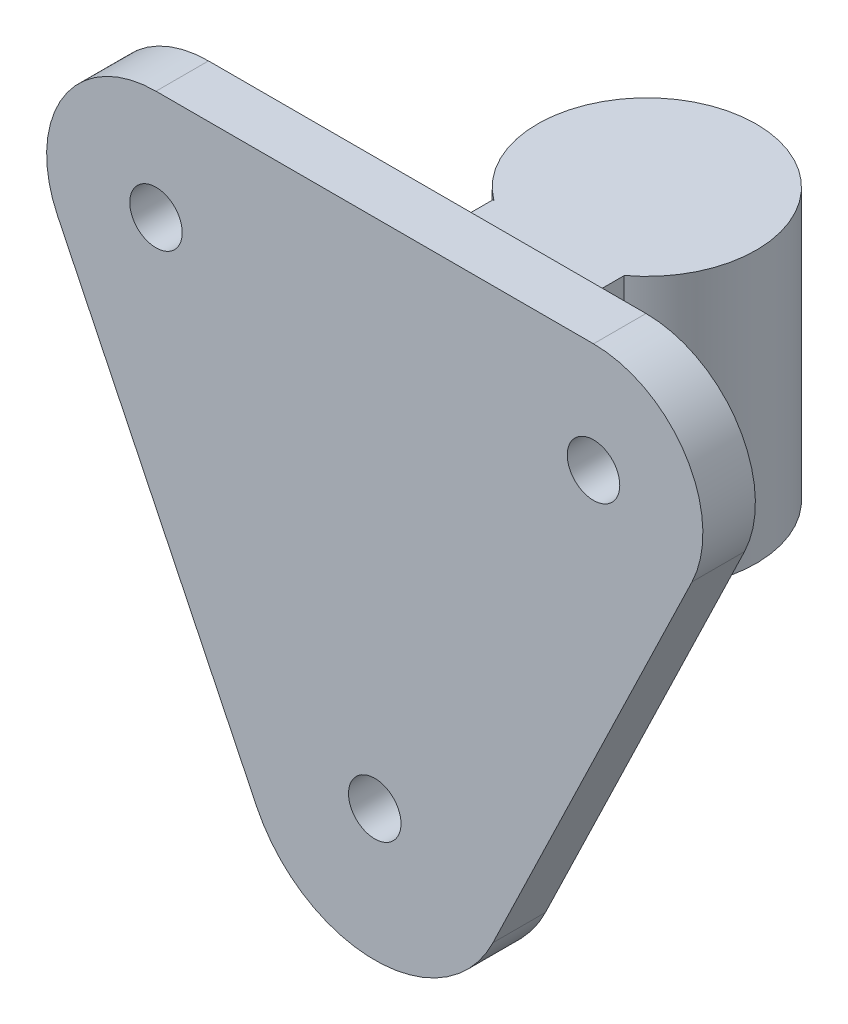
ISO-10303-21;
HEADER;
FILE_DESCRIPTION(('STEP AP214'),'2;1');
FILE_NAME('part.step','',(''),(''),'','','');
FILE_SCHEMA(('AUTOMOTIVE_DESIGN { 1 0 10303 214 1 1 1 1 }'));
ENDSEC;
DATA;
#1=APPLICATION_CONTEXT('core data for automotive mechanical design processes');
#2=APPLICATION_PROTOCOL_DEFINITION('international standard','automotive_design',2000,#1);
#3=PRODUCT_CONTEXT('',#1,'mechanical');
#4=PRODUCT('Part','Part','',(#3));
#5=PRODUCT_RELATED_PRODUCT_CATEGORY('part','',(#4));
#6=PRODUCT_DEFINITION_FORMATION('','',#4);
#7=PRODUCT_DEFINITION_CONTEXT('part definition',#1,'design');
#8=PRODUCT_DEFINITION('design','',#6,#7);
#9=PRODUCT_DEFINITION_SHAPE('','',#8);
#10=(LENGTH_UNIT() NAMED_UNIT(*) SI_UNIT(.MILLI.,.METRE.));
#11=(NAMED_UNIT(*) PLANE_ANGLE_UNIT() SI_UNIT($,.RADIAN.));
#12=(NAMED_UNIT(*) SI_UNIT($,.STERADIAN.) SOLID_ANGLE_UNIT());
#13=UNCERTAINTY_MEASURE_WITH_UNIT(LENGTH_MEASURE(1.E-05),#10,'distance_accuracy_value','');
#14=(GEOMETRIC_REPRESENTATION_CONTEXT(3) GLOBAL_UNCERTAINTY_ASSIGNED_CONTEXT((#13)) GLOBAL_UNIT_ASSIGNED_CONTEXT((#10,
#11,#12)) REPRESENTATION_CONTEXT('',''));
#15=CARTESIAN_POINT('',(0.,0.,0.));
#16=DIRECTION('',(0.,0.,1.));
#17=DIRECTION('',(1.,0.,0.));
#18=AXIS2_PLACEMENT_3D('',#15,#16,#17);
#19=CARTESIAN_POINT('',(-28.5820222076042,46.1801134077303,0.));
#20=DIRECTION('',(0.,0.,1.));
#21=DIRECTION('',(1.,0.,0.));
#22=AXIS2_PLACEMENT_3D('',#19,#20,#21);
#23=PLANE('',#22);
#24=CARTESIAN_POINT('',(-78.5820222076042,-45.8198865922697,0.));
#25=DIRECTION('',(0.,0.,1.));
#26=DIRECTION('',(1.,0.,0.));
#27=AXIS2_PLACEMENT_3D('',#24,#25,#26);
#28=CIRCLE('',#27,6.);
#29=CARTESIAN_POINT('',(-72.5820222076042,-45.8198865922697,0.));
#30=VERTEX_POINT('',#29);
#31=EDGE_CURVE('E206',#30,#30,#28,.T.);
#32=ORIENTED_EDGE('',*,*,#31,.T.);
#33=EDGE_LOOP('',(#32));
#34=FACE_BOUND('',#33,.T.);
#35=CARTESIAN_POINT('',(-28.5820222076042,46.1801134077303,0.));
#36=DIRECTION('',(0.,0.,1.));
#37=DIRECTION('',(1.,0.,0.));
#38=AXIS2_PLACEMENT_3D('',#35,#36,#37);
#39=CIRCLE('',#38,6.);
#40=CARTESIAN_POINT('',(-22.5820222076042,46.1801134077303,0.));
#41=VERTEX_POINT('',#40);
#42=EDGE_CURVE('E198',#41,#41,#39,.T.);
#43=ORIENTED_EDGE('',*,*,#42,.T.);
#44=EDGE_LOOP('',(#43));
#45=FACE_BOUND('',#44,.T.);
#46=CARTESIAN_POINT('',(-128.582022207604,46.1801134077303,0.));
#47=DIRECTION('',(0.,0.,1.));
#48=DIRECTION('',(1.,0.,0.));
#49=AXIS2_PLACEMENT_3D('',#46,#47,#48);
#50=CIRCLE('',#49,6.);
#51=CARTESIAN_POINT('',(-122.582022207604,46.1801134077303,0.));
#52=VERTEX_POINT('',#51);
#53=EDGE_CURVE('E189',#52,#52,#50,.T.);
#54=ORIENTED_EDGE('',*,*,#53,.T.);
#55=EDGE_LOOP('',(#54));
#56=FACE_BOUND('',#55,.T.);
#57=CARTESIAN_POINT('',(-28.5820222076042,46.1801134077303,0.));
#58=DIRECTION('',(0.,0.,1.));
#59=DIRECTION('',(1.,0.,0.));
#60=AXIS2_PLACEMENT_3D('',#57,#58,#59);
#61=CIRCLE('',#60,25.);
#62=CARTESIAN_POINT('',(-6.07141921436445,35.3047856940131,0.));
#63=VERTEX_POINT('',#62);
#64=CARTESIAN_POINT('',(-28.5820222076042,71.1801134077303,0.));
#65=VERTEX_POINT('',#64);
#66=EDGE_CURVE('E148',#63,#65,#61,.T.);
#67=ORIENTED_EDGE('',*,*,#66,.F.);
#68=DIRECTION('',(0.43501310854869,0.900424119729589,0.));
#69=VECTOR('',#68,1.);
#70=CARTESIAN_POINT('',(-6.07141921436445,35.3047856940131,0.));
#71=LINE('',#70,#69);
#72=CARTESIAN_POINT('',(-51.5692986157165,-58.8702798487304,0.));
#73=VERTEX_POINT('',#72);
#74=EDGE_CURVE('E97',#73,#63,#71,.T.);
#75=ORIENTED_EDGE('',*,*,#74,.F.);
#76=CARTESIAN_POINT('',(-78.5820222076042,-45.8198865922697,0.));
#77=DIRECTION('',(0.,0.,1.));
#78=DIRECTION('',(1.,0.,0.));
#79=AXIS2_PLACEMENT_3D('',#76,#77,#78);
#80=CIRCLE('',#79,30.);
#81=CARTESIAN_POINT('',(-105.594745799492,-58.8702798487304,0.));
#82=VERTEX_POINT('',#81);
#83=EDGE_CURVE('E161',#82,#73,#80,.T.);
#84=ORIENTED_EDGE('',*,*,#83,.F.);
#85=DIRECTION('',(0.43501310854869,-0.900424119729589,0.));
#86=VECTOR('',#85,1.);
#87=CARTESIAN_POINT('',(-151.092625200844,35.3047856940131,0.));
#88=LINE('',#87,#86);
#89=CARTESIAN_POINT('',(-151.092625200844,35.3047856940131,0.));
#90=VERTEX_POINT('',#89);
#91=EDGE_CURVE('E133',#90,#82,#88,.T.);
#92=ORIENTED_EDGE('',*,*,#91,.F.);
#93=CARTESIAN_POINT('',(-128.582022207604,46.1801134077303,0.));
#94=DIRECTION('',(0.,0.,1.));
#95=DIRECTION('',(1.,0.,0.));
#96=AXIS2_PLACEMENT_3D('',#93,#94,#95);
#97=CIRCLE('',#96,25.);
#98=CARTESIAN_POINT('',(-128.582022207604,71.1801134077303,0.));
#99=VERTEX_POINT('',#98);
#100=EDGE_CURVE('E156',#99,#90,#97,.T.);
#101=ORIENTED_EDGE('',*,*,#100,.F.);
#102=DIRECTION('',(-1.,0.,0.));
#103=VECTOR('',#102,1.);
#104=CARTESIAN_POINT('',(-128.582022207604,71.1801134077303,0.));
#105=LINE('',#104,#103);
#106=EDGE_CURVE('E152',#65,#99,#105,.T.);
#107=ORIENTED_EDGE('',*,*,#106,.F.);
#108=EDGE_LOOP('',(#67,#75,#84,#92,#101,#107));
#109=FACE_BOUND('',#108,.T.);
#110=DIRECTION('',(1.,0.,0.));
#111=VECTOR('',#110,1.);
#112=CARTESIAN_POINT('',(-93.5820222076042,-15.8198865922697,0.));
#113=LINE('',#112,#111);
#114=CARTESIAN_POINT('',(-93.5820222076042,-15.8198865922697,0.));
#115=VERTEX_POINT('',#114);
#116=CARTESIAN_POINT('',(-63.5820222076042,-15.8198865922697,0.));
#117=VERTEX_POINT('',#116);
#118=EDGE_CURVE('E273',#115,#117,#113,.T.);
#119=ORIENTED_EDGE('',*,*,#118,.T.);
#120=DIRECTION('',(0.,1.,0.));
#121=VECTOR('',#120,1.);
#122=CARTESIAN_POINT('',(-63.5820222076042,-15.8198865922697,0.));
#123=LINE('',#122,#121);
#124=CARTESIAN_POINT('',(-63.5820222076042,46.1801134077303,0.));
#125=VERTEX_POINT('',#124);
#126=EDGE_CURVE('E217',#117,#125,#123,.T.);
#127=ORIENTED_EDGE('',*,*,#126,.T.);
#128=DIRECTION('',(1.,0.,0.));
#129=VECTOR('',#128,1.);
#130=CARTESIAN_POINT('',(-93.5820222076042,46.1801134077303,0.));
#131=LINE('',#130,#129);
#132=CARTESIAN_POINT('',(-93.5820222076042,46.1801134077303,0.));
#133=VERTEX_POINT('',#132);
#134=EDGE_CURVE('E253',#133,#125,#131,.T.);
#135=ORIENTED_EDGE('',*,*,#134,.F.);
#136=DIRECTION('',(0.,1.,0.));
#137=VECTOR('',#136,1.);
#138=CARTESIAN_POINT('',(-93.5820222076042,-15.8198865922697,0.));
#139=LINE('',#138,#137);
#140=EDGE_CURVE('E214',#115,#133,#139,.T.);
#141=ORIENTED_EDGE('',*,*,#140,.F.);
#142=EDGE_LOOP('',(#119,#127,#135,#141));
#143=FACE_BOUND('',#142,.T.);
#144=ADVANCED_FACE('F45',(#34,#45,#56,#109,#143),#23,.F.);
#145=CARTESIAN_POINT('',(-28.5820222076042,46.1801134077303,12.));
#146=DIRECTION('',(0.,0.,1.));
#147=DIRECTION('',(1.,0.,0.));
#148=AXIS2_PLACEMENT_3D('',#145,#146,#147);
#149=PLANE('',#148);
#150=CARTESIAN_POINT('',(-28.5820222076042,46.1801134077303,12.));
#151=DIRECTION('',(0.,0.,1.));
#152=DIRECTION('',(1.,0.,0.));
#153=AXIS2_PLACEMENT_3D('',#150,#151,#152);
#154=CIRCLE('',#153,6.);
#155=CARTESIAN_POINT('',(-22.5820222076042,46.1801134077303,12.));
#156=VERTEX_POINT('',#155);
#157=EDGE_CURVE('E194',#156,#156,#154,.T.);
#158=ORIENTED_EDGE('',*,*,#157,.F.);
#159=EDGE_LOOP('',(#158));
#160=FACE_BOUND('',#159,.T.);
#161=CARTESIAN_POINT('',(-28.5820222076042,46.1801134077303,12.));
#162=DIRECTION('',(0.,0.,1.));
#163=DIRECTION('',(1.,0.,0.));
#164=AXIS2_PLACEMENT_3D('',#161,#162,#163);
#165=CIRCLE('',#164,25.);
#166=CARTESIAN_POINT('',(-6.07141921436445,35.3047856940131,12.));
#167=VERTEX_POINT('',#166);
#168=CARTESIAN_POINT('',(-28.5820222076042,71.1801134077303,12.));
#169=VERTEX_POINT('',#168);
#170=EDGE_CURVE('E166',#167,#169,#165,.T.);
#171=ORIENTED_EDGE('',*,*,#170,.T.);
#172=DIRECTION('',(-1.,0.,0.));
#173=VECTOR('',#172,1.);
#174=CARTESIAN_POINT('',(-128.582022207604,71.1801134077303,12.));
#175=LINE('',#174,#173);
#176=CARTESIAN_POINT('',(-128.582022207604,71.1801134077303,12.));
#177=VERTEX_POINT('',#176);
#178=EDGE_CURVE('E105',#169,#177,#175,.T.);
#179=ORIENTED_EDGE('',*,*,#178,.T.);
#180=CARTESIAN_POINT('',(-128.582022207604,46.1801134077303,12.));
#181=DIRECTION('',(0.,0.,1.));
#182=DIRECTION('',(1.,0.,0.));
#183=AXIS2_PLACEMENT_3D('',#180,#181,#182);
#184=CIRCLE('',#183,25.);
#185=CARTESIAN_POINT('',(-151.092625200844,35.3047856940131,12.));
#186=VERTEX_POINT('',#185);
#187=EDGE_CURVE('E123',#177,#186,#184,.T.);
#188=ORIENTED_EDGE('',*,*,#187,.T.);
#189=DIRECTION('',(0.43501310854869,-0.900424119729589,0.));
#190=VECTOR('',#189,1.);
#191=CARTESIAN_POINT('',(-151.092625200844,35.3047856940131,12.));
#192=LINE('',#191,#190);
#193=CARTESIAN_POINT('',(-105.594745799492,-58.8702798487304,12.));
#194=VERTEX_POINT('',#193);
#195=EDGE_CURVE('E115',#186,#194,#192,.T.);
#196=ORIENTED_EDGE('',*,*,#195,.T.);
#197=CARTESIAN_POINT('',(-78.5820222076042,-45.8198865922697,12.));
#198=DIRECTION('',(0.,0.,1.));
#199=DIRECTION('',(1.,0.,0.));
#200=AXIS2_PLACEMENT_3D('',#197,#198,#199);
#201=CIRCLE('',#200,30.);
#202=CARTESIAN_POINT('',(-51.5692986157165,-58.8702798487304,12.));
#203=VERTEX_POINT('',#202);
#204=EDGE_CURVE('E120',#194,#203,#201,.T.);
#205=ORIENTED_EDGE('',*,*,#204,.T.);
#206=DIRECTION('',(0.43501310854869,0.900424119729589,0.));
#207=VECTOR('',#206,1.);
#208=CARTESIAN_POINT('',(-6.07141921436445,35.3047856940131,12.));
#209=LINE('',#208,#207);
#210=EDGE_CURVE('E70',#203,#167,#209,.T.);
#211=ORIENTED_EDGE('',*,*,#210,.T.);
#212=EDGE_LOOP('',(#171,#179,#188,#196,#205,#211));
#213=FACE_BOUND('',#212,.T.);
#214=CARTESIAN_POINT('',(-128.582022207604,46.1801134077303,12.));
#215=DIRECTION('',(0.,0.,1.));
#216=DIRECTION('',(1.,0.,0.));
#217=AXIS2_PLACEMENT_3D('',#214,#215,#216);
#218=CIRCLE('',#217,6.);
#219=CARTESIAN_POINT('',(-122.582022207604,46.1801134077303,12.));
#220=VERTEX_POINT('',#219);
#221=EDGE_CURVE('E153',#220,#220,#218,.T.);
#222=ORIENTED_EDGE('',*,*,#221,.F.);
#223=EDGE_LOOP('',(#222));
#224=FACE_BOUND('',#223,.T.);
#225=CARTESIAN_POINT('',(-78.5820222076042,-45.8198865922697,12.));
#226=DIRECTION('',(0.,0.,1.));
#227=DIRECTION('',(1.,0.,0.));
#228=AXIS2_PLACEMENT_3D('',#225,#226,#227);
#229=CIRCLE('',#228,6.);
#230=CARTESIAN_POINT('',(-72.5820222076042,-45.8198865922697,12.));
#231=VERTEX_POINT('',#230);
#232=EDGE_CURVE('E202',#231,#231,#229,.T.);
#233=ORIENTED_EDGE('',*,*,#232,.F.);
#234=EDGE_LOOP('',(#233));
#235=FACE_BOUND('',#234,.T.);
#236=ADVANCED_FACE('F117',(#160,#213,#224,#235),#149,.T.);
#237=CARTESIAN_POINT('',(-28.5820222076042,46.1801134077303,12.));
#238=DIRECTION('',(0.,0.,-1.));
#239=DIRECTION('',(-1.,0.,0.));
#240=AXIS2_PLACEMENT_3D('',#237,#238,#239);
#241=CYLINDRICAL_SURFACE('',#240,25.);
#242=ORIENTED_EDGE('',*,*,#66,.T.);
#243=DIRECTION('',(0.,0.,-1.));
#244=VECTOR('',#243,1.);
#245=CARTESIAN_POINT('',(-28.5820222076042,71.1801134077303,12.));
#246=LINE('',#245,#244);
#247=EDGE_CURVE('E11',#169,#65,#246,.T.);
#248=ORIENTED_EDGE('',*,*,#247,.F.);
#249=ORIENTED_EDGE('',*,*,#170,.F.);
#250=DIRECTION('',(0.,0.,-1.));
#251=VECTOR('',#250,1.);
#252=CARTESIAN_POINT('',(-6.07141921436445,35.3047856940131,12.));
#253=LINE('',#252,#251);
#254=EDGE_CURVE('E144',#167,#63,#253,.T.);
#255=ORIENTED_EDGE('',*,*,#254,.T.);
#256=EDGE_LOOP('',(#242,#248,#249,#255));
#257=FACE_BOUND('',#256,.T.);
#258=ADVANCED_FACE('F47',(#257),#241,.T.);
#259=CARTESIAN_POINT('',(-128.582022207604,71.1801134077303,12.));
#260=DIRECTION('',(0.,-1.,0.));
#261=DIRECTION('',(0.,0.,-1.));
#262=AXIS2_PLACEMENT_3D('',#259,#260,#261);
#263=PLANE('',#262);
#264=ORIENTED_EDGE('',*,*,#106,.T.);
#265=DIRECTION('',(0.,0.,-1.));
#266=VECTOR('',#265,1.);
#267=CARTESIAN_POINT('',(-128.582022207604,71.1801134077303,12.));
#268=LINE('',#267,#266);
#269=EDGE_CURVE('E54',#177,#99,#268,.T.);
#270=ORIENTED_EDGE('',*,*,#269,.F.);
#271=ORIENTED_EDGE('',*,*,#178,.F.);
#272=ORIENTED_EDGE('',*,*,#247,.T.);
#273=EDGE_LOOP('',(#264,#270,#271,#272));
#274=FACE_BOUND('',#273,.T.);
#275=ADVANCED_FACE('F357',(#274),#263,.F.);
#276=CARTESIAN_POINT('',(-128.582022207604,46.1801134077303,12.));
#277=DIRECTION('',(0.,0.,-1.));
#278=DIRECTION('',(-1.,0.,0.));
#279=AXIS2_PLACEMENT_3D('',#276,#277,#278);
#280=CYLINDRICAL_SURFACE('',#279,25.);
#281=ORIENTED_EDGE('',*,*,#100,.T.);
#282=DIRECTION('',(0.,0.,-1.));
#283=VECTOR('',#282,1.);
#284=CARTESIAN_POINT('',(-151.092625200844,35.3047856940131,12.));
#285=LINE('',#284,#283);
#286=EDGE_CURVE('E137',#186,#90,#285,.T.);
#287=ORIENTED_EDGE('',*,*,#286,.F.);
#288=ORIENTED_EDGE('',*,*,#187,.F.);
#289=ORIENTED_EDGE('',*,*,#269,.T.);
#290=EDGE_LOOP('',(#281,#287,#288,#289));
#291=FACE_BOUND('',#290,.T.);
#292=ADVANCED_FACE('F176',(#291),#280,.T.);
#293=CARTESIAN_POINT('',(-151.092625200844,35.3047856940131,12.));
#294=DIRECTION('',(0.900424119729589,0.43501310854869,0.));
#295=DIRECTION('',(-0.43501310854869,0.900424119729589,0.));
#296=AXIS2_PLACEMENT_3D('',#293,#294,#295);
#297=PLANE('',#296);
#298=ORIENTED_EDGE('',*,*,#91,.T.);
#299=DIRECTION('',(0.,0.,-1.));
#300=VECTOR('',#299,1.);
#301=CARTESIAN_POINT('',(-105.594745799492,-58.8702798487304,12.));
#302=LINE('',#301,#300);
#303=EDGE_CURVE('E130',#194,#82,#302,.T.);
#304=ORIENTED_EDGE('',*,*,#303,.F.);
#305=ORIENTED_EDGE('',*,*,#195,.F.);
#306=ORIENTED_EDGE('',*,*,#286,.T.);
#307=EDGE_LOOP('',(#298,#304,#305,#306));
#308=FACE_BOUND('',#307,.T.);
#309=ADVANCED_FACE('F131',(#308),#297,.F.);
#310=CARTESIAN_POINT('',(-78.5820222076042,-45.8198865922697,12.));
#311=DIRECTION('',(0.,0.,-1.));
#312=DIRECTION('',(-1.,0.,0.));
#313=AXIS2_PLACEMENT_3D('',#310,#311,#312);
#314=CYLINDRICAL_SURFACE('',#313,30.);
#315=ORIENTED_EDGE('',*,*,#83,.T.);
#316=DIRECTION('',(0.,0.,-1.));
#317=VECTOR('',#316,1.);
#318=CARTESIAN_POINT('',(-51.5692986157165,-58.8702798487304,12.));
#319=LINE('',#318,#317);
#320=EDGE_CURVE('E138',#203,#73,#319,.T.);
#321=ORIENTED_EDGE('',*,*,#320,.F.);
#322=ORIENTED_EDGE('',*,*,#204,.F.);
#323=ORIENTED_EDGE('',*,*,#303,.T.);
#324=EDGE_LOOP('',(#315,#321,#322,#323));
#325=FACE_BOUND('',#324,.T.);
#326=ADVANCED_FACE('F140',(#325),#314,.T.);
#327=CARTESIAN_POINT('',(-6.07141921436445,35.3047856940131,12.));
#328=DIRECTION('',(-0.900424119729589,0.43501310854869,0.));
#329=DIRECTION('',(-0.43501310854869,-0.900424119729589,0.));
#330=AXIS2_PLACEMENT_3D('',#327,#328,#329);
#331=PLANE('',#330);
#332=ORIENTED_EDGE('',*,*,#74,.T.);
#333=ORIENTED_EDGE('',*,*,#254,.F.);
#334=ORIENTED_EDGE('',*,*,#210,.F.);
#335=ORIENTED_EDGE('',*,*,#320,.T.);
#336=EDGE_LOOP('',(#332,#333,#334,#335));
#337=FACE_BOUND('',#336,.T.);
#338=ADVANCED_FACE('F180',(#337),#331,.F.);
#339=CARTESIAN_POINT('',(-128.582022207604,46.1801134077303,12.));
#340=DIRECTION('',(0.,0.,-1.));
#341=DIRECTION('',(-1.,0.,0.));
#342=AXIS2_PLACEMENT_3D('',#339,#340,#341);
#343=CYLINDRICAL_SURFACE('',#342,6.);
#344=ORIENTED_EDGE('',*,*,#221,.T.);
#345=EDGE_LOOP('',(#344));
#346=FACE_BOUND('',#345,.T.);
#347=ORIENTED_EDGE('',*,*,#53,.F.);
#348=EDGE_LOOP('',(#347));
#349=FACE_BOUND('',#348,.T.);
#350=ADVANCED_FACE('F351',(#346,#349),#343,.F.);
#351=CARTESIAN_POINT('',(-28.5820222076042,46.1801134077303,12.));
#352=DIRECTION('',(0.,0.,-1.));
#353=DIRECTION('',(-1.,0.,0.));
#354=AXIS2_PLACEMENT_3D('',#351,#352,#353);
#355=CYLINDRICAL_SURFACE('',#354,6.);
#356=ORIENTED_EDGE('',*,*,#157,.T.);
#357=EDGE_LOOP('',(#356));
#358=FACE_BOUND('',#357,.T.);
#359=ORIENTED_EDGE('',*,*,#42,.F.);
#360=EDGE_LOOP('',(#359));
#361=FACE_BOUND('',#360,.T.);
#362=ADVANCED_FACE('F403',(#358,#361),#355,.F.);
#363=CARTESIAN_POINT('',(-78.5820222076042,-45.8198865922697,12.));
#364=DIRECTION('',(0.,0.,-1.));
#365=DIRECTION('',(-1.,0.,0.));
#366=AXIS2_PLACEMENT_3D('',#363,#364,#365);
#367=CYLINDRICAL_SURFACE('',#366,6.);
#368=ORIENTED_EDGE('',*,*,#232,.T.);
#369=EDGE_LOOP('',(#368));
#370=FACE_BOUND('',#369,.T.);
#371=ORIENTED_EDGE('',*,*,#31,.F.);
#372=EDGE_LOOP('',(#371));
#373=FACE_BOUND('',#372,.T.);
#374=ADVANCED_FACE('F411',(#370,#373),#367,.F.);
#375=CARTESIAN_POINT('',(-93.5820222076042,-15.8198865922697,0.));
#376=DIRECTION('',(-1.,0.,0.));
#377=DIRECTION('',(0.,0.,1.));
#378=AXIS2_PLACEMENT_3D('',#375,#376,#377);
#379=PLANE('',#378);
#380=DIRECTION('',(0.,0.,1.));
#381=VECTOR('',#380,1.);
#382=CARTESIAN_POINT('',(-93.5820222076042,46.1801134077303,0.));
#383=LINE('',#382,#381);
#384=CARTESIAN_POINT('',(-93.5820222076042,46.1801134077303,-30.));
#385=VERTEX_POINT('',#384);
#386=EDGE_CURVE('E61',#385,#133,#383,.T.);
#387=ORIENTED_EDGE('',*,*,#386,.F.);
#388=DIRECTION('',(0.,1.,0.));
#389=VECTOR('',#388,1.);
#390=CARTESIAN_POINT('',(-93.5820222076042,-15.8198865922697,-30.));
#391=LINE('',#390,#389);
#392=CARTESIAN_POINT('',(-93.5820222076042,-15.8198865922697,-30.));
#393=VERTEX_POINT('',#392);
#394=EDGE_CURVE('E210',#393,#385,#391,.T.);
#395=ORIENTED_EDGE('',*,*,#394,.F.);
#396=DIRECTION('',(0.,0.,1.));
#397=VECTOR('',#396,1.);
#398=CARTESIAN_POINT('',(-93.5820222076042,-15.8198865922697,0.));
#399=LINE('',#398,#397);
#400=EDGE_CURVE('E240',#393,#115,#399,.T.);
#401=ORIENTED_EDGE('',*,*,#400,.T.);
#402=ORIENTED_EDGE('',*,*,#140,.T.);
#403=EDGE_LOOP('',(#387,#395,#401,#402));
#404=FACE_BOUND('',#403,.T.);
#405=ADVANCED_FACE('F284',(#404),#379,.T.);
#406=CARTESIAN_POINT('',(-93.5820222076042,-15.8198865922697,-30.));
#407=DIRECTION('',(0.,0.,-1.));
#408=DIRECTION('',(-1.,0.,0.));
#409=AXIS2_PLACEMENT_3D('',#406,#407,#408);
#410=PLANE('',#409);
#411=DIRECTION('',(-1.,0.,0.));
#412=VECTOR('',#411,1.);
#413=CARTESIAN_POINT('',(-93.5820222076042,46.1801134077303,-30.));
#414=LINE('',#413,#412);
#415=CARTESIAN_POINT('',(-93.3492697913279,46.1801134077303,-30.));
#416=VERTEX_POINT('',#415);
#417=EDGE_CURVE('E237',#416,#385,#414,.T.);
#418=ORIENTED_EDGE('',*,*,#417,.F.);
#419=DIRECTION('',(0.,1.,0.));
#420=VECTOR('',#419,1.);
#421=CARTESIAN_POINT('',(-93.3492697913279,-15.8198865922697,-30.));
#422=LINE('',#421,#420);
#423=CARTESIAN_POINT('',(-93.3492697913279,-15.8198865922697,-30.));
#424=VERTEX_POINT('',#423);
#425=EDGE_CURVE('E230',#424,#416,#422,.T.);
#426=ORIENTED_EDGE('',*,*,#425,.F.);
#427=DIRECTION('',(-1.,0.,0.));
#428=VECTOR('',#427,1.);
#429=CARTESIAN_POINT('',(-93.5820222076042,-15.8198865922697,-30.));
#430=LINE('',#429,#428);
#431=EDGE_CURVE('E218',#424,#393,#430,.T.);
#432=ORIENTED_EDGE('',*,*,#431,.T.);
#433=ORIENTED_EDGE('',*,*,#394,.T.);
#434=EDGE_LOOP('',(#418,#426,#432,#433));
#435=FACE_BOUND('',#434,.T.);
#436=ADVANCED_FACE('F309',(#435),#410,.T.);
#437=CARTESIAN_POINT('',(-78.50591033199,-15.8198865922697,-50.116527532377));
#438=DIRECTION('',(0.,1.,0.));
#439=DIRECTION('',(0.,0.,1.));
#440=AXIS2_PLACEMENT_3D('',#437,#438,#439);
#441=CYLINDRICAL_SURFACE('',#440,25.);
#442=CARTESIAN_POINT('',(-78.50591033199,46.1801134077303,-50.116527532377));
#443=DIRECTION('',(0.,1.,0.));
#444=DIRECTION('',(0.,0.,1.));
#445=AXIS2_PLACEMENT_3D('',#442,#443,#444);
#446=CIRCLE('',#445,25.);
#447=CARTESIAN_POINT('',(-63.662550872652,46.1801134077303,-30.));
#448=VERTEX_POINT('',#447);
#449=EDGE_CURVE('E241',#448,#416,#446,.T.);
#450=ORIENTED_EDGE('',*,*,#449,.F.);
#451=DIRECTION('',(0.,1.,0.));
#452=VECTOR('',#451,1.);
#453=CARTESIAN_POINT('',(-63.662550872652,-15.8198865922697,-30.));
#454=LINE('',#453,#452);
#455=CARTESIAN_POINT('',(-63.662550872652,-15.8198865922697,-30.));
#456=VERTEX_POINT('',#455);
#457=EDGE_CURVE('E226',#456,#448,#454,.T.);
#458=ORIENTED_EDGE('',*,*,#457,.F.);
#459=CARTESIAN_POINT('',(-78.50591033199,-15.8198865922697,-50.116527532377));
#460=DIRECTION('',(0.,1.,0.));
#461=DIRECTION('',(0.,0.,1.));
#462=AXIS2_PLACEMENT_3D('',#459,#460,#461);
#463=CIRCLE('',#462,25.);
#464=EDGE_CURVE('E261',#456,#424,#463,.T.);
#465=ORIENTED_EDGE('',*,*,#464,.T.);
#466=ORIENTED_EDGE('',*,*,#425,.T.);
#467=EDGE_LOOP('',(#450,#458,#465,#466));
#468=FACE_BOUND('',#467,.T.);
#469=ADVANCED_FACE('F312',(#468),#441,.T.);
#470=CARTESIAN_POINT('',(-63.662550872652,-15.8198865922697,-30.));
#471=DIRECTION('',(0.,0.,-1.));
#472=DIRECTION('',(-1.,0.,0.));
#473=AXIS2_PLACEMENT_3D('',#470,#471,#472);
#474=PLANE('',#473);
#475=DIRECTION('',(-1.,0.,0.));
#476=VECTOR('',#475,1.);
#477=CARTESIAN_POINT('',(-63.662550872652,46.1801134077303,-30.));
#478=LINE('',#477,#476);
#479=CARTESIAN_POINT('',(-63.5820222076042,46.1801134077303,-30.));
#480=VERTEX_POINT('',#479);
#481=EDGE_CURVE('E245',#480,#448,#478,.T.);
#482=ORIENTED_EDGE('',*,*,#481,.F.);
#483=DIRECTION('',(0.,1.,0.));
#484=VECTOR('',#483,1.);
#485=CARTESIAN_POINT('',(-63.5820222076042,-15.8198865922697,-30.));
#486=LINE('',#485,#484);
#487=CARTESIAN_POINT('',(-63.5820222076042,-15.8198865922697,-30.));
#488=VERTEX_POINT('',#487);
#489=EDGE_CURVE('E222',#488,#480,#486,.T.);
#490=ORIENTED_EDGE('',*,*,#489,.F.);
#491=DIRECTION('',(-1.,0.,0.));
#492=VECTOR('',#491,1.);
#493=CARTESIAN_POINT('',(-63.662550872652,-15.8198865922697,-30.));
#494=LINE('',#493,#492);
#495=EDGE_CURVE('E265',#488,#456,#494,.T.);
#496=ORIENTED_EDGE('',*,*,#495,.T.);
#497=ORIENTED_EDGE('',*,*,#457,.T.);
#498=EDGE_LOOP('',(#482,#490,#496,#497));
#499=FACE_BOUND('',#498,.T.);
#500=ADVANCED_FACE('F323',(#499),#474,.T.);
#501=CARTESIAN_POINT('',(-63.5820222076042,-15.8198865922697,0.));
#502=DIRECTION('',(1.,0.,0.));
#503=DIRECTION('',(0.,0.,-1.));
#504=AXIS2_PLACEMENT_3D('',#501,#502,#503);
#505=PLANE('',#504);
#506=DIRECTION('',(0.,0.,-1.));
#507=VECTOR('',#506,1.);
#508=CARTESIAN_POINT('',(-63.5820222076042,46.1801134077303,0.));
#509=LINE('',#508,#507);
#510=EDGE_CURVE('E249',#125,#480,#509,.T.);
#511=ORIENTED_EDGE('',*,*,#510,.F.);
#512=ORIENTED_EDGE('',*,*,#126,.F.);
#513=DIRECTION('',(0.,0.,-1.));
#514=VECTOR('',#513,1.);
#515=CARTESIAN_POINT('',(-63.5820222076042,-15.8198865922697,0.));
#516=LINE('',#515,#514);
#517=EDGE_CURVE('E269',#117,#488,#516,.T.);
#518=ORIENTED_EDGE('',*,*,#517,.T.);
#519=ORIENTED_EDGE('',*,*,#489,.T.);
#520=EDGE_LOOP('',(#511,#512,#518,#519));
#521=FACE_BOUND('',#520,.T.);
#522=ADVANCED_FACE('F325',(#521),#505,.T.);
#523=CARTESIAN_POINT('',(-78.50591033199,-15.8198865922697,-50.116527532377));
#524=DIRECTION('',(0.,1.,0.));
#525=DIRECTION('',(0.,0.,1.));
#526=AXIS2_PLACEMENT_3D('',#523,#524,#525);
#527=PLANE('',#526);
#528=ORIENTED_EDGE('',*,*,#400,.F.);
#529=ORIENTED_EDGE('',*,*,#431,.F.);
#530=ORIENTED_EDGE('',*,*,#464,.F.);
#531=ORIENTED_EDGE('',*,*,#495,.F.);
#532=ORIENTED_EDGE('',*,*,#517,.F.);
#533=ORIENTED_EDGE('',*,*,#118,.F.);
#534=EDGE_LOOP('',(#528,#529,#530,#531,#532,#533));
#535=FACE_BOUND('',#534,.T.);
#536=ADVANCED_FACE('F320',(#535),#527,.F.);
#537=CARTESIAN_POINT('',(-78.50591033199,46.1801134077303,-50.116527532377));
#538=DIRECTION('',(0.,1.,0.));
#539=DIRECTION('',(0.,0.,1.));
#540=AXIS2_PLACEMENT_3D('',#537,#538,#539);
#541=PLANE('',#540);
#542=ORIENTED_EDGE('',*,*,#386,.T.);
#543=ORIENTED_EDGE('',*,*,#134,.T.);
#544=ORIENTED_EDGE('',*,*,#510,.T.);
#545=ORIENTED_EDGE('',*,*,#481,.T.);
#546=ORIENTED_EDGE('',*,*,#449,.T.);
#547=ORIENTED_EDGE('',*,*,#417,.T.);
#548=EDGE_LOOP('',(#542,#543,#544,#545,#546,#547));
#549=FACE_BOUND('',#548,.T.);
#550=ADVANCED_FACE('F293',(#549),#541,.T.);
#551=CLOSED_SHELL('',(#144,#236,#258,#275,#292,#309,#326,#338,#350,#362,#374,#405,#436,#469,
#500,#522,#536,#550));
#552=MANIFOLD_SOLID_BREP('B2',#551);
#553=ADVANCED_BREP_SHAPE_REPRESENTATION('',(#18,#552),#14);
#554=SHAPE_DEFINITION_REPRESENTATION(#9,#553);
ENDSEC;
END-ISO-10303-21;
